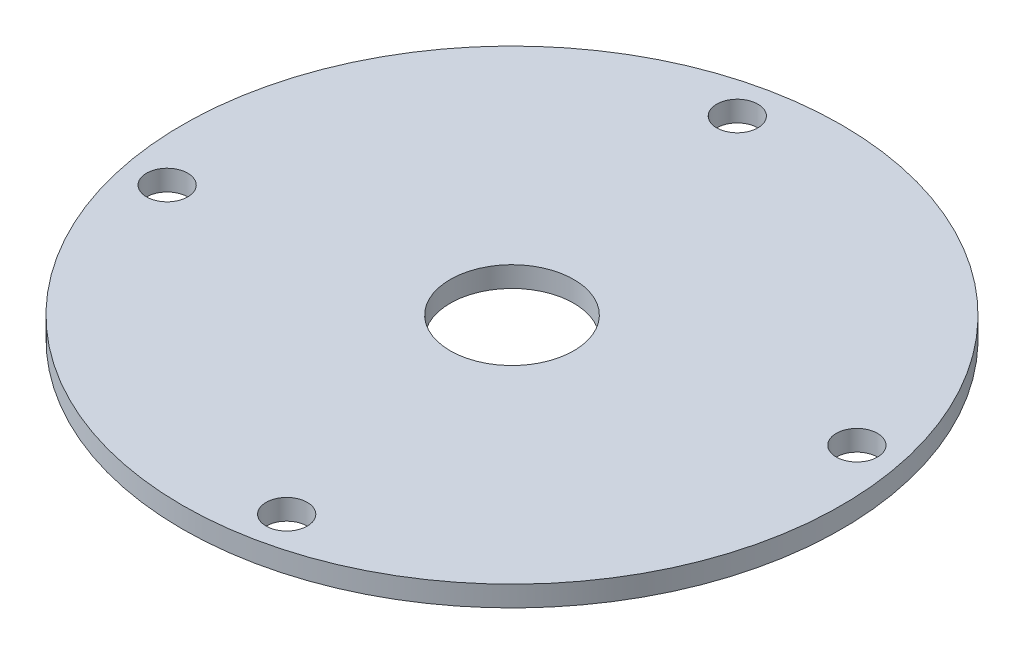
ISO-10303-21;
HEADER;
FILE_DESCRIPTION(('STEP AP214'),'2;1');
FILE_NAME('part.step','',(''),(''),'','','');
FILE_SCHEMA(('AUTOMOTIVE_DESIGN { 1 0 10303 214 1 1 1 1 }'));
ENDSEC;
DATA;
#1=APPLICATION_CONTEXT('core data for automotive mechanical design processes');
#2=APPLICATION_PROTOCOL_DEFINITION('international standard','automotive_design',2000,#1);
#3=PRODUCT_CONTEXT('',#1,'mechanical');
#4=PRODUCT('Part','Part','',(#3));
#5=PRODUCT_RELATED_PRODUCT_CATEGORY('part','',(#4));
#6=PRODUCT_DEFINITION_FORMATION('','',#4);
#7=PRODUCT_DEFINITION_CONTEXT('part definition',#1,'design');
#8=PRODUCT_DEFINITION('design','',#6,#7);
#9=PRODUCT_DEFINITION_SHAPE('','',#8);
#10=(LENGTH_UNIT() NAMED_UNIT(*) SI_UNIT(.MILLI.,.METRE.));
#11=(NAMED_UNIT(*) PLANE_ANGLE_UNIT() SI_UNIT($,.RADIAN.));
#12=(NAMED_UNIT(*) SI_UNIT($,.STERADIAN.) SOLID_ANGLE_UNIT());
#13=UNCERTAINTY_MEASURE_WITH_UNIT(LENGTH_MEASURE(1.E-05),#10,'distance_accuracy_value','');
#14=(GEOMETRIC_REPRESENTATION_CONTEXT(3) GLOBAL_UNCERTAINTY_ASSIGNED_CONTEXT((#13)) GLOBAL_UNIT_ASSIGNED_CONTEXT((#10,
#11,#12)) REPRESENTATION_CONTEXT('',''));
#15=CARTESIAN_POINT('',(0.,0.,0.));
#16=DIRECTION('',(0.,0.,1.));
#17=DIRECTION('',(1.,0.,0.));
#18=AXIS2_PLACEMENT_3D('',#15,#16,#17);
#19=CARTESIAN_POINT('',(0.,3.175,0.));
#20=DIRECTION('',(0.,1.,0.));
#21=DIRECTION('',(0.,0.,1.));
#22=AXIS2_PLACEMENT_3D('',#19,#20,#21);
#23=PLANE('',#22);
#24=CARTESIAN_POINT('',(9.21464266183947,3.175,43.9455954631929));
#25=DIRECTION('',(0.,1.,0.));
#26=DIRECTION('',(0.,0.,1.));
#27=AXIS2_PLACEMENT_3D('',#24,#25,#26);
#28=CIRCLE('',#27,3.175);
#29=CARTESIAN_POINT('',(9.21464266183947,3.175,47.1205954631929));
#30=VERTEX_POINT('',#29);
#31=EDGE_CURVE('E74',#30,#30,#28,.T.);
#32=ORIENTED_EDGE('',*,*,#31,.F.);
#33=EDGE_LOOP('',(#32));
#34=FACE_BOUND('',#33,.T.);
#35=CARTESIAN_POINT('',(43.9455954631928,3.175,-9.2146426618397));
#36=DIRECTION('',(0.,1.,0.));
#37=DIRECTION('',(0.,0.,1.));
#38=AXIS2_PLACEMENT_3D('',#35,#36,#37);
#39=CIRCLE('',#38,3.175);
#40=CARTESIAN_POINT('',(43.9455954631928,3.175,-6.0396426618397));
#41=VERTEX_POINT('',#40);
#42=EDGE_CURVE('E68',#41,#41,#39,.T.);
#43=ORIENTED_EDGE('',*,*,#42,.F.);
#44=EDGE_LOOP('',(#43));
#45=FACE_BOUND('',#44,.T.);
#46=CARTESIAN_POINT('',(-9.21464266183987,3.175,-43.945595463193));
#47=DIRECTION('',(0.,1.,0.));
#48=DIRECTION('',(0.,0.,1.));
#49=AXIS2_PLACEMENT_3D('',#46,#47,#48);
#50=CIRCLE('',#49,3.175);
#51=CARTESIAN_POINT('',(-9.21464266183987,3.175,-40.770595463193));
#52=VERTEX_POINT('',#51);
#53=EDGE_CURVE('E62',#52,#52,#50,.T.);
#54=ORIENTED_EDGE('',*,*,#53,.F.);
#55=EDGE_LOOP('',(#54));
#56=FACE_BOUND('',#55,.T.);
#57=CARTESIAN_POINT('',(-43.9455954631932,3.175,9.21464266183964));
#58=DIRECTION('',(0.,1.,0.));
#59=DIRECTION('',(0.,0.,1.));
#60=AXIS2_PLACEMENT_3D('',#57,#58,#59);
#61=CIRCLE('',#60,3.175);
#62=CARTESIAN_POINT('',(-43.9455954631932,3.175,12.3896426618396));
#63=VERTEX_POINT('',#62);
#64=EDGE_CURVE('E56',#63,#63,#61,.T.);
#65=ORIENTED_EDGE('',*,*,#64,.F.);
#66=EDGE_LOOP('',(#65));
#67=FACE_BOUND('',#66,.T.);
#68=CARTESIAN_POINT('',(0.,3.175,0.));
#69=DIRECTION('',(0.,1.,0.));
#70=DIRECTION('',(0.,0.,1.));
#71=AXIS2_PLACEMENT_3D('',#68,#69,#70);
#72=CIRCLE('',#71,50.8);
#73=CARTESIAN_POINT('',(0.,3.175,50.8));
#74=VERTEX_POINT('',#73);
#75=EDGE_CURVE('E11',#74,#74,#72,.T.);
#76=ORIENTED_EDGE('',*,*,#75,.T.);
#77=EDGE_LOOP('',(#76));
#78=FACE_BOUND('',#77,.T.);
#79=CARTESIAN_POINT('',(0.,3.175,0.));
#80=DIRECTION('',(0.,1.,0.));
#81=DIRECTION('',(0.,0.,1.));
#82=AXIS2_PLACEMENT_3D('',#79,#80,#81);
#83=CIRCLE('',#82,9.525);
#84=CARTESIAN_POINT('',(0.,3.175,9.525));
#85=VERTEX_POINT('',#84);
#86=EDGE_CURVE('E48',#85,#85,#83,.T.);
#87=ORIENTED_EDGE('',*,*,#86,.F.);
#88=EDGE_LOOP('',(#87));
#89=FACE_BOUND('',#88,.T.);
#90=ADVANCED_FACE('F37',(#34,#45,#56,#67,#78,#89),#23,.T.);
#91=CARTESIAN_POINT('',(0.,0.,0.));
#92=DIRECTION('',(0.,1.,0.));
#93=DIRECTION('',(0.,0.,1.));
#94=AXIS2_PLACEMENT_3D('',#91,#92,#93);
#95=PLANE('',#94);
#96=CARTESIAN_POINT('',(9.21464266183947,0.,43.9455954631929));
#97=DIRECTION('',(0.,1.,0.));
#98=DIRECTION('',(0.,0.,1.));
#99=AXIS2_PLACEMENT_3D('',#96,#97,#98);
#100=CIRCLE('',#99,3.175);
#101=CARTESIAN_POINT('',(9.21464266183947,0.,47.1205954631929));
#102=VERTEX_POINT('',#101);
#103=EDGE_CURVE('E71',#102,#102,#100,.T.);
#104=ORIENTED_EDGE('',*,*,#103,.T.);
#105=EDGE_LOOP('',(#104));
#106=FACE_BOUND('',#105,.T.);
#107=CARTESIAN_POINT('',(43.9455954631928,0.,-9.2146426618397));
#108=DIRECTION('',(0.,1.,0.));
#109=DIRECTION('',(0.,0.,1.));
#110=AXIS2_PLACEMENT_3D('',#107,#108,#109);
#111=CIRCLE('',#110,3.175);
#112=CARTESIAN_POINT('',(43.9455954631928,0.,-6.0396426618397));
#113=VERTEX_POINT('',#112);
#114=EDGE_CURVE('E65',#113,#113,#111,.T.);
#115=ORIENTED_EDGE('',*,*,#114,.T.);
#116=EDGE_LOOP('',(#115));
#117=FACE_BOUND('',#116,.T.);
#118=CARTESIAN_POINT('',(-9.21464266183987,0.,-43.945595463193));
#119=DIRECTION('',(0.,1.,0.));
#120=DIRECTION('',(0.,0.,1.));
#121=AXIS2_PLACEMENT_3D('',#118,#119,#120);
#122=CIRCLE('',#121,3.175);
#123=CARTESIAN_POINT('',(-9.21464266183987,0.,-40.770595463193));
#124=VERTEX_POINT('',#123);
#125=EDGE_CURVE('E59',#124,#124,#122,.T.);
#126=ORIENTED_EDGE('',*,*,#125,.T.);
#127=EDGE_LOOP('',(#126));
#128=FACE_BOUND('',#127,.T.);
#129=CARTESIAN_POINT('',(-43.9455954631932,0.,9.21464266183964));
#130=DIRECTION('',(0.,1.,0.));
#131=DIRECTION('',(0.,0.,1.));
#132=AXIS2_PLACEMENT_3D('',#129,#130,#131);
#133=CIRCLE('',#132,3.175);
#134=CARTESIAN_POINT('',(-43.9455954631932,0.,12.3896426618396));
#135=VERTEX_POINT('',#134);
#136=EDGE_CURVE('E53',#135,#135,#133,.T.);
#137=ORIENTED_EDGE('',*,*,#136,.T.);
#138=EDGE_LOOP('',(#137));
#139=FACE_BOUND('',#138,.T.);
#140=CARTESIAN_POINT('',(0.,0.,0.));
#141=DIRECTION('',(0.,1.,0.));
#142=DIRECTION('',(0.,0.,1.));
#143=AXIS2_PLACEMENT_3D('',#140,#141,#142);
#144=CIRCLE('',#143,50.8);
#145=CARTESIAN_POINT('',(0.,0.,50.8));
#146=VERTEX_POINT('',#145);
#147=EDGE_CURVE('E41',#146,#146,#144,.T.);
#148=ORIENTED_EDGE('',*,*,#147,.F.);
#149=EDGE_LOOP('',(#148));
#150=FACE_BOUND('',#149,.T.);
#151=CARTESIAN_POINT('',(0.,0.,0.));
#152=DIRECTION('',(0.,1.,0.));
#153=DIRECTION('',(0.,0.,1.));
#154=AXIS2_PLACEMENT_3D('',#151,#152,#153);
#155=CIRCLE('',#154,9.525);
#156=CARTESIAN_POINT('',(0.,0.,9.525));
#157=VERTEX_POINT('',#156);
#158=EDGE_CURVE('E50',#157,#157,#155,.T.);
#159=ORIENTED_EDGE('',*,*,#158,.T.);
#160=EDGE_LOOP('',(#159));
#161=FACE_BOUND('',#160,.T.);
#162=ADVANCED_FACE('F80',(#106,#117,#128,#139,#150,#161),#95,.F.);
#163=CARTESIAN_POINT('',(0.,3.175,0.));
#164=DIRECTION('',(0.,-1.,0.));
#165=DIRECTION('',(0.,0.,-1.));
#166=AXIS2_PLACEMENT_3D('',#163,#164,#165);
#167=CYLINDRICAL_SURFACE('',#166,50.8);
#168=ORIENTED_EDGE('',*,*,#75,.F.);
#169=EDGE_LOOP('',(#168));
#170=FACE_BOUND('',#169,.T.);
#171=ORIENTED_EDGE('',*,*,#147,.T.);
#172=EDGE_LOOP('',(#171));
#173=FACE_BOUND('',#172,.T.);
#174=ADVANCED_FACE('F39',(#170,#173),#167,.T.);
#175=CARTESIAN_POINT('',(0.,3.175,0.));
#176=DIRECTION('',(0.,-1.,0.));
#177=DIRECTION('',(0.,0.,-1.));
#178=AXIS2_PLACEMENT_3D('',#175,#176,#177);
#179=CYLINDRICAL_SURFACE('',#178,9.525);
#180=ORIENTED_EDGE('',*,*,#86,.T.);
#181=EDGE_LOOP('',(#180));
#182=FACE_BOUND('',#181,.T.);
#183=ORIENTED_EDGE('',*,*,#158,.F.);
#184=EDGE_LOOP('',(#183));
#185=FACE_BOUND('',#184,.T.);
#186=ADVANCED_FACE('F101',(#182,#185),#179,.F.);
#187=CARTESIAN_POINT('',(-43.9455954631932,0.,9.21464266183964));
#188=DIRECTION('',(0.,1.,0.));
#189=DIRECTION('',(0.,0.,1.));
#190=AXIS2_PLACEMENT_3D('',#187,#188,#189);
#191=CYLINDRICAL_SURFACE('',#190,3.175);
#192=ORIENTED_EDGE('',*,*,#136,.F.);
#193=EDGE_LOOP('',(#192));
#194=FACE_BOUND('',#193,.T.);
#195=ORIENTED_EDGE('',*,*,#64,.T.);
#196=EDGE_LOOP('',(#195));
#197=FACE_BOUND('',#196,.T.);
#198=ADVANCED_FACE('F104',(#194,#197),#191,.F.);
#199=CARTESIAN_POINT('',(-9.21464266183987,0.,-43.945595463193));
#200=DIRECTION('',(0.,1.,0.));
#201=DIRECTION('',(0.,0.,1.));
#202=AXIS2_PLACEMENT_3D('',#199,#200,#201);
#203=CYLINDRICAL_SURFACE('',#202,3.175);
#204=ORIENTED_EDGE('',*,*,#125,.F.);
#205=EDGE_LOOP('',(#204));
#206=FACE_BOUND('',#205,.T.);
#207=ORIENTED_EDGE('',*,*,#53,.T.);
#208=EDGE_LOOP('',(#207));
#209=FACE_BOUND('',#208,.T.);
#210=ADVANCED_FACE('F116',(#206,#209),#203,.F.);
#211=CARTESIAN_POINT('',(43.9455954631928,0.,-9.2146426618397));
#212=DIRECTION('',(0.,1.,0.));
#213=DIRECTION('',(0.,0.,1.));
#214=AXIS2_PLACEMENT_3D('',#211,#212,#213);
#215=CYLINDRICAL_SURFACE('',#214,3.175);
#216=ORIENTED_EDGE('',*,*,#114,.F.);
#217=EDGE_LOOP('',(#216));
#218=FACE_BOUND('',#217,.T.);
#219=ORIENTED_EDGE('',*,*,#42,.T.);
#220=EDGE_LOOP('',(#219));
#221=FACE_BOUND('',#220,.T.);
#222=ADVANCED_FACE('F86',(#218,#221),#215,.F.);
#223=CARTESIAN_POINT('',(9.21464266183947,0.,43.9455954631929));
#224=DIRECTION('',(0.,1.,0.));
#225=DIRECTION('',(0.,0.,1.));
#226=AXIS2_PLACEMENT_3D('',#223,#224,#225);
#227=CYLINDRICAL_SURFACE('',#226,3.175);
#228=ORIENTED_EDGE('',*,*,#103,.F.);
#229=EDGE_LOOP('',(#228));
#230=FACE_BOUND('',#229,.T.);
#231=ORIENTED_EDGE('',*,*,#31,.T.);
#232=EDGE_LOOP('',(#231));
#233=FACE_BOUND('',#232,.T.);
#234=ADVANCED_FACE('F83',(#230,#233),#227,.F.);
#235=CLOSED_SHELL('',(#90,#162,#174,#186,#198,#210,#222,#234));
#236=MANIFOLD_SOLID_BREP('B2',#235);
#237=ADVANCED_BREP_SHAPE_REPRESENTATION('',(#18,#236),#14);
#238=SHAPE_DEFINITION_REPRESENTATION(#9,#237);
ENDSEC;
END-ISO-10303-21;
